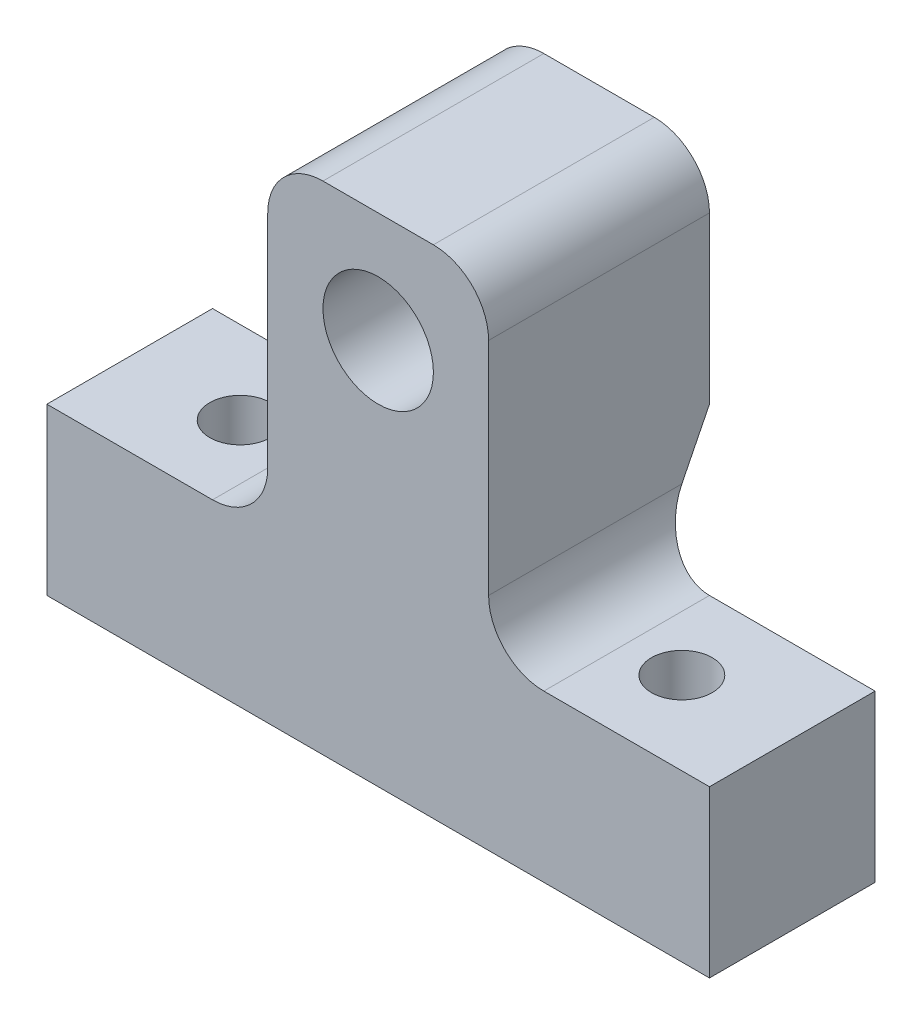
ISO-10303-21;
HEADER;
FILE_DESCRIPTION(('STEP AP214'),'2;1');
FILE_NAME('part.step','',(''),(''),'','','');
FILE_SCHEMA(('AUTOMOTIVE_DESIGN { 1 0 10303 214 1 1 1 1 }'));
ENDSEC;
DATA;
#1=APPLICATION_CONTEXT('core data for automotive mechanical design processes');
#2=APPLICATION_PROTOCOL_DEFINITION('international standard','automotive_design',2000,#1);
#3=PRODUCT_CONTEXT('',#1,'mechanical');
#4=PRODUCT('Part','Part','',(#3));
#5=PRODUCT_RELATED_PRODUCT_CATEGORY('part','',(#4));
#6=PRODUCT_DEFINITION_FORMATION('','',#4);
#7=PRODUCT_DEFINITION_CONTEXT('part definition',#1,'design');
#8=PRODUCT_DEFINITION('design','',#6,#7);
#9=PRODUCT_DEFINITION_SHAPE('','',#8);
#10=(LENGTH_UNIT() NAMED_UNIT(*) SI_UNIT(.MILLI.,.METRE.));
#11=(NAMED_UNIT(*) PLANE_ANGLE_UNIT() SI_UNIT($,.RADIAN.));
#12=(NAMED_UNIT(*) SI_UNIT($,.STERADIAN.) SOLID_ANGLE_UNIT());
#13=UNCERTAINTY_MEASURE_WITH_UNIT(LENGTH_MEASURE(1.E-05),#10,'distance_accuracy_value','');
#14=(GEOMETRIC_REPRESENTATION_CONTEXT(3) GLOBAL_UNCERTAINTY_ASSIGNED_CONTEXT((#13)) GLOBAL_UNIT_ASSIGNED_CONTEXT((#10,
#11,#12)) REPRESENTATION_CONTEXT('',''));
#15=CARTESIAN_POINT('',(0.,0.,0.));
#16=DIRECTION('',(0.,0.,1.));
#17=DIRECTION('',(1.,0.,0.));
#18=AXIS2_PLACEMENT_3D('',#15,#16,#17);
#19=CARTESIAN_POINT('',(0.,27.5,7.5));
#20=DIRECTION('',(0.,0.,-1.));
#21=DIRECTION('',(-1.,0.,0.));
#22=AXIS2_PLACEMENT_3D('',#19,#20,#21);
#23=CYLINDRICAL_SURFACE('',#22,5.);
#24=CARTESIAN_POINT('',(0.,27.5,7.5));
#25=DIRECTION('',(0.,0.,1.));
#26=DIRECTION('',(1.,0.,0.));
#27=AXIS2_PLACEMENT_3D('',#24,#25,#26);
#28=CIRCLE('',#27,5.);
#29=CARTESIAN_POINT('',(5.,27.5,7.5));
#30=VERTEX_POINT('',#29);
#31=EDGE_CURVE('E171',#30,#30,#28,.T.);
#32=ORIENTED_EDGE('',*,*,#31,.T.);
#33=EDGE_LOOP('',(#32));
#34=FACE_BOUND('',#33,.T.);
#35=CARTESIAN_POINT('',(0.,27.5,-11.5));
#36=DIRECTION('',(0.,0.,-1.));
#37=DIRECTION('',(-1.,0.,0.));
#38=AXIS2_PLACEMENT_3D('',#35,#36,#37);
#39=CIRCLE('',#38,5.);
#40=CARTESIAN_POINT('',(-5.,27.5,-11.5));
#41=VERTEX_POINT('',#40);
#42=EDGE_CURVE('E157',#41,#41,#39,.T.);
#43=ORIENTED_EDGE('',*,*,#42,.T.);
#44=EDGE_LOOP('',(#43));
#45=FACE_BOUND('',#44,.T.);
#46=ADVANCED_FACE('F41',(#34,#45),#23,.F.);
#47=CARTESIAN_POINT('',(0.,0.,7.5));
#48=DIRECTION('',(0.,0.,-1.));
#49=DIRECTION('',(-1.,0.,0.));
#50=AXIS2_PLACEMENT_3D('',#47,#48,#49);
#51=PLANE('',#50);
#52=DIRECTION('',(0.,1.,0.));
#53=VECTOR('',#52,1.);
#54=CARTESIAN_POINT('',(10.,37.5,7.5));
#55=LINE('',#54,#53);
#56=CARTESIAN_POINT('',(10.,12.5,7.5));
#57=VERTEX_POINT('',#56);
#58=CARTESIAN_POINT('',(10.,32.5,7.5));
#59=VERTEX_POINT('',#58);
#60=EDGE_CURVE('E188',#57,#59,#55,.T.);
#61=ORIENTED_EDGE('',*,*,#60,.T.);
#62=CARTESIAN_POINT('',(5.,32.5,7.5));
#63=DIRECTION('',(0.,0.,-1.));
#64=DIRECTION('',(-1.,0.,0.));
#65=AXIS2_PLACEMENT_3D('',#62,#63,#64);
#66=CIRCLE('',#65,5.);
#67=CARTESIAN_POINT('',(5.,37.5,7.5));
#68=VERTEX_POINT('',#67);
#69=EDGE_CURVE('E239',#59,#68,#66,.F.);
#70=ORIENTED_EDGE('',*,*,#69,.T.);
#71=DIRECTION('',(-1.,0.,0.));
#72=VECTOR('',#71,1.);
#73=CARTESIAN_POINT('',(-9.99999999999999,37.5,7.5));
#74=LINE('',#73,#72);
#75=CARTESIAN_POINT('',(-4.99999999999999,37.5,7.5));
#76=VERTEX_POINT('',#75);
#77=EDGE_CURVE('E194',#68,#76,#74,.T.);
#78=ORIENTED_EDGE('',*,*,#77,.T.);
#79=CARTESIAN_POINT('',(-4.99999999999999,32.5,7.5));
#80=DIRECTION('',(0.,0.,-1.));
#81=DIRECTION('',(-1.,0.,0.));
#82=AXIS2_PLACEMENT_3D('',#79,#80,#81);
#83=CIRCLE('',#82,5.);
#84=CARTESIAN_POINT('',(-9.99999999999999,32.5,7.5));
#85=VERTEX_POINT('',#84);
#86=EDGE_CURVE('E238',#76,#85,#83,.F.);
#87=ORIENTED_EDGE('',*,*,#86,.T.);
#88=DIRECTION('',(0.,-1.,0.));
#89=VECTOR('',#88,1.);
#90=CARTESIAN_POINT('',(-9.99999999999999,37.5,7.5));
#91=LINE('',#90,#89);
#92=CARTESIAN_POINT('',(-9.99999999999999,12.5,7.5));
#93=VERTEX_POINT('',#92);
#94=EDGE_CURVE('E196',#85,#93,#91,.T.);
#95=ORIENTED_EDGE('',*,*,#94,.T.);
#96=CARTESIAN_POINT('',(-15.,12.5,7.5));
#97=DIRECTION('',(0.,0.,-1.));
#98=DIRECTION('',(-1.,0.,0.));
#99=AXIS2_PLACEMENT_3D('',#96,#97,#98);
#100=CIRCLE('',#99,5.);
#101=CARTESIAN_POINT('',(-15.,7.5,7.5));
#102=VERTEX_POINT('',#101);
#103=EDGE_CURVE('E251',#93,#102,#100,.T.);
#104=ORIENTED_EDGE('',*,*,#103,.T.);
#105=DIRECTION('',(-1.,0.,0.));
#106=VECTOR('',#105,1.);
#107=CARTESIAN_POINT('',(-30.,7.5,7.5));
#108=LINE('',#107,#106);
#109=CARTESIAN_POINT('',(-30.,7.5,7.5));
#110=VERTEX_POINT('',#109);
#111=EDGE_CURVE('E197',#102,#110,#108,.T.);
#112=ORIENTED_EDGE('',*,*,#111,.T.);
#113=DIRECTION('',(0.,-1.,0.));
#114=VECTOR('',#113,1.);
#115=CARTESIAN_POINT('',(-30.,-7.5,7.5));
#116=LINE('',#115,#114);
#117=CARTESIAN_POINT('',(-30.,-7.5,7.5));
#118=VERTEX_POINT('',#117);
#119=EDGE_CURVE('E202',#110,#118,#116,.T.);
#120=ORIENTED_EDGE('',*,*,#119,.T.);
#121=DIRECTION('',(1.,0.,0.));
#122=VECTOR('',#121,1.);
#123=CARTESIAN_POINT('',(-30.,-7.5,7.5));
#124=LINE('',#123,#122);
#125=CARTESIAN_POINT('',(30.,-7.5,7.5));
#126=VERTEX_POINT('',#125);
#127=EDGE_CURVE('E204',#118,#126,#124,.T.);
#128=ORIENTED_EDGE('',*,*,#127,.T.);
#129=DIRECTION('',(0.,1.,0.));
#130=VECTOR('',#129,1.);
#131=CARTESIAN_POINT('',(30.,-7.5,7.5));
#132=LINE('',#131,#130);
#133=CARTESIAN_POINT('',(30.,7.5,7.5));
#134=VERTEX_POINT('',#133);
#135=EDGE_CURVE('E182',#126,#134,#132,.T.);
#136=ORIENTED_EDGE('',*,*,#135,.T.);
#137=DIRECTION('',(-1.,0.,0.));
#138=VECTOR('',#137,1.);
#139=CARTESIAN_POINT('',(10.,7.5,7.5));
#140=LINE('',#139,#138);
#141=CARTESIAN_POINT('',(15.,7.5,7.5));
#142=VERTEX_POINT('',#141);
#143=EDGE_CURVE('E187',#134,#142,#140,.T.);
#144=ORIENTED_EDGE('',*,*,#143,.T.);
#145=CARTESIAN_POINT('',(15.,12.5,7.5));
#146=DIRECTION('',(0.,0.,-1.));
#147=DIRECTION('',(-1.,0.,0.));
#148=AXIS2_PLACEMENT_3D('',#145,#146,#147);
#149=CIRCLE('',#148,5.);
#150=EDGE_CURVE('E11',#142,#57,#149,.T.);
#151=ORIENTED_EDGE('',*,*,#150,.T.);
#152=EDGE_LOOP('',(#61,#70,#78,#87,#95,#104,#112,#120,#128,#136,#144,#151));
#153=FACE_BOUND('',#152,.T.);
#154=ORIENTED_EDGE('',*,*,#31,.F.);
#155=EDGE_LOOP('',(#154));
#156=FACE_BOUND('',#155,.T.);
#157=ADVANCED_FACE('F261',(#153,#156),#51,.F.);
#158=CARTESIAN_POINT('',(0.,0.,-7.5));
#159=DIRECTION('',(0.,0.,-1.));
#160=DIRECTION('',(-1.,0.,0.));
#161=AXIS2_PLACEMENT_3D('',#158,#159,#160);
#162=PLANE('',#161);
#163=DIRECTION('',(-1.,0.,0.));
#164=VECTOR('',#163,1.);
#165=CARTESIAN_POINT('',(-30.,7.5,-7.5));
#166=LINE('',#165,#164);
#167=CARTESIAN_POINT('',(-15.,7.50000000000008,-7.5));
#168=VERTEX_POINT('',#167);
#169=CARTESIAN_POINT('',(-30.,7.5,-7.5));
#170=VERTEX_POINT('',#169);
#171=EDGE_CURVE('E208',#168,#170,#166,.T.);
#172=ORIENTED_EDGE('',*,*,#171,.F.);
#173=DIRECTION('',(1.,0.,0.));
#174=VECTOR('',#173,1.);
#175=CARTESIAN_POINT('',(0.,7.50000000000008,-7.5));
#176=LINE('',#175,#174);
#177=CARTESIAN_POINT('',(15.,7.5,-7.5));
#178=VERTEX_POINT('',#177);
#179=EDGE_CURVE('E57',#168,#178,#176,.T.);
#180=ORIENTED_EDGE('',*,*,#179,.T.);
#181=DIRECTION('',(-1.,0.,0.));
#182=VECTOR('',#181,1.);
#183=CARTESIAN_POINT('',(10.,7.5,-7.5));
#184=LINE('',#183,#182);
#185=CARTESIAN_POINT('',(30.,7.5,-7.5));
#186=VERTEX_POINT('',#185);
#187=EDGE_CURVE('E206',#186,#178,#184,.T.);
#188=ORIENTED_EDGE('',*,*,#187,.F.);
#189=DIRECTION('',(0.,1.,0.));
#190=VECTOR('',#189,1.);
#191=CARTESIAN_POINT('',(30.,-7.5,-7.5));
#192=LINE('',#191,#190);
#193=CARTESIAN_POINT('',(30.,-7.5,-7.5));
#194=VERTEX_POINT('',#193);
#195=EDGE_CURVE('E185',#194,#186,#192,.T.);
#196=ORIENTED_EDGE('',*,*,#195,.F.);
#197=DIRECTION('',(1.,0.,0.));
#198=VECTOR('',#197,1.);
#199=CARTESIAN_POINT('',(-30.,-7.5,-7.5));
#200=LINE('',#199,#198);
#201=CARTESIAN_POINT('',(-30.,-7.5,-7.5));
#202=VERTEX_POINT('',#201);
#203=EDGE_CURVE('E190',#202,#194,#200,.T.);
#204=ORIENTED_EDGE('',*,*,#203,.F.);
#205=DIRECTION('',(0.,-1.,0.));
#206=VECTOR('',#205,1.);
#207=CARTESIAN_POINT('',(-30.,-7.5,-7.5));
#208=LINE('',#207,#206);
#209=EDGE_CURVE('E215',#170,#202,#208,.T.);
#210=ORIENTED_EDGE('',*,*,#209,.F.);
#211=EDGE_LOOP('',(#172,#180,#188,#196,#204,#210));
#212=FACE_BOUND('',#211,.T.);
#213=ADVANCED_FACE('F272',(#212),#162,.T.);
#214=CARTESIAN_POINT('',(30.,-7.5,7.5));
#215=DIRECTION('',(-1.,0.,0.));
#216=DIRECTION('',(0.,0.,1.));
#217=AXIS2_PLACEMENT_3D('',#214,#215,#216);
#218=PLANE('',#217);
#219=ORIENTED_EDGE('',*,*,#195,.T.);
#220=DIRECTION('',(0.,0.,-1.));
#221=VECTOR('',#220,1.);
#222=CARTESIAN_POINT('',(30.,7.5,7.5));
#223=LINE('',#222,#221);
#224=EDGE_CURVE('E224',#134,#186,#223,.T.);
#225=ORIENTED_EDGE('',*,*,#224,.F.);
#226=ORIENTED_EDGE('',*,*,#135,.F.);
#227=DIRECTION('',(0.,0.,-1.));
#228=VECTOR('',#227,1.);
#229=CARTESIAN_POINT('',(30.,-7.5,7.5));
#230=LINE('',#229,#228);
#231=EDGE_CURVE('E203',#126,#194,#230,.T.);
#232=ORIENTED_EDGE('',*,*,#231,.T.);
#233=EDGE_LOOP('',(#219,#225,#226,#232));
#234=FACE_BOUND('',#233,.T.);
#235=ADVANCED_FACE('F269',(#234),#218,.F.);
#236=CARTESIAN_POINT('',(10.,7.5,7.5));
#237=DIRECTION('',(0.,-1.,0.));
#238=DIRECTION('',(0.,0.,-1.));
#239=AXIS2_PLACEMENT_3D('',#236,#237,#238);
#240=PLANE('',#239);
#241=CARTESIAN_POINT('',(20.,7.5,0.));
#242=DIRECTION('',(0.,1.,0.));
#243=DIRECTION('',(0.,0.,1.));
#244=AXIS2_PLACEMENT_3D('',#241,#242,#243);
#245=CIRCLE('',#244,2.75);
#246=CARTESIAN_POINT('',(20.,7.5,2.74999999999999));
#247=VERTEX_POINT('',#246);
#248=EDGE_CURVE('E175',#247,#247,#245,.T.);
#249=ORIENTED_EDGE('',*,*,#248,.F.);
#250=EDGE_LOOP('',(#249));
#251=FACE_BOUND('',#250,.T.);
#252=ORIENTED_EDGE('',*,*,#187,.T.);
#253=DIRECTION('',(0.,0.,-1.));
#254=VECTOR('',#253,1.);
#255=CARTESIAN_POINT('',(15.,7.5,7.5));
#256=LINE('',#255,#254);
#257=EDGE_CURVE('E249',#178,#142,#256,.F.);
#258=ORIENTED_EDGE('',*,*,#257,.T.);
#259=ORIENTED_EDGE('',*,*,#143,.F.);
#260=ORIENTED_EDGE('',*,*,#224,.T.);
#261=EDGE_LOOP('',(#252,#258,#259,#260));
#262=FACE_BOUND('',#261,.T.);
#263=ADVANCED_FACE('F256',(#251,#262),#240,.F.);
#264=CARTESIAN_POINT('',(10.,37.5,7.5));
#265=DIRECTION('',(-1.,0.,0.));
#266=DIRECTION('',(0.,-1.,0.));
#267=AXIS2_PLACEMENT_3D('',#264,#265,#266);
#268=PLANE('',#267);
#269=DIRECTION('',(0.,-1.,0.));
#270=VECTOR('',#269,1.);
#271=CARTESIAN_POINT('',(10.,37.5,-12.5));
#272=LINE('',#271,#270);
#273=CARTESIAN_POINT('',(10.,32.5,-12.5));
#274=VERTEX_POINT('',#273);
#275=CARTESIAN_POINT('',(10.,17.5,-12.5));
#276=VERTEX_POINT('',#275);
#277=EDGE_CURVE('E139',#274,#276,#272,.T.);
#278=ORIENTED_EDGE('',*,*,#277,.F.);
#279=DIRECTION('',(0.,0.,-1.));
#280=VECTOR('',#279,1.);
#281=CARTESIAN_POINT('',(10.,32.5,7.5));
#282=LINE('',#281,#280);
#283=EDGE_CURVE('E236',#274,#59,#282,.F.);
#284=ORIENTED_EDGE('',*,*,#283,.T.);
#285=ORIENTED_EDGE('',*,*,#60,.F.);
#286=DIRECTION('',(0.,0.,-1.));
#287=VECTOR('',#286,1.);
#288=CARTESIAN_POINT('',(10.,12.5,-7.5));
#289=LINE('',#288,#287);
#290=CARTESIAN_POINT('',(10.,12.5,-9.99999999999997));
#291=VERTEX_POINT('',#290);
#292=EDGE_CURVE('E145',#57,#291,#289,.T.);
#293=ORIENTED_EDGE('',*,*,#292,.T.);
#294=DIRECTION('',(0.,0.894427190999915,-0.447213595499959));
#295=VECTOR('',#294,1.);
#296=CARTESIAN_POINT('',(10.,25.5,-16.5));
#297=LINE('',#296,#295);
#298=EDGE_CURVE('E134',#291,#276,#297,.T.);
#299=ORIENTED_EDGE('',*,*,#298,.T.);
#300=EDGE_LOOP('',(#278,#284,#285,#293,#299));
#301=FACE_BOUND('',#300,.T.);
#302=ADVANCED_FACE('F140',(#301),#268,.F.);
#303=CARTESIAN_POINT('',(-9.99999999999999,37.5,7.5));
#304=DIRECTION('',(0.,-1.,0.));
#305=DIRECTION('',(0.,0.,-1.));
#306=AXIS2_PLACEMENT_3D('',#303,#304,#305);
#307=PLANE('',#306);
#308=ORIENTED_EDGE('',*,*,#77,.F.);
#309=DIRECTION('',(0.,0.,-1.));
#310=VECTOR('',#309,1.);
#311=CARTESIAN_POINT('',(5.,37.5,7.5));
#312=LINE('',#311,#310);
#313=CARTESIAN_POINT('',(5.,37.5,-12.5));
#314=VERTEX_POINT('',#313);
#315=EDGE_CURVE('E230',#68,#314,#312,.T.);
#316=ORIENTED_EDGE('',*,*,#315,.T.);
#317=DIRECTION('',(1.,0.,0.));
#318=VECTOR('',#317,1.);
#319=CARTESIAN_POINT('',(10.,37.5,-12.5));
#320=LINE('',#319,#318);
#321=CARTESIAN_POINT('',(-4.99999999999999,37.5,-12.5));
#322=VERTEX_POINT('',#321);
#323=EDGE_CURVE('E162',#322,#314,#320,.T.);
#324=ORIENTED_EDGE('',*,*,#323,.F.);
#325=DIRECTION('',(0.,0.,-1.));
#326=VECTOR('',#325,1.);
#327=CARTESIAN_POINT('',(-4.99999999999999,37.5,7.5));
#328=LINE('',#327,#326);
#329=EDGE_CURVE('E144',#322,#76,#328,.F.);
#330=ORIENTED_EDGE('',*,*,#329,.T.);
#331=EDGE_LOOP('',(#308,#316,#324,#330));
#332=FACE_BOUND('',#331,.T.);
#333=ADVANCED_FACE('F300',(#332),#307,.F.);
#334=CARTESIAN_POINT('',(-9.99999999999999,37.5,7.5));
#335=DIRECTION('',(1.,0.,0.));
#336=DIRECTION('',(0.,1.,0.));
#337=AXIS2_PLACEMENT_3D('',#334,#335,#336);
#338=PLANE('',#337);
#339=ORIENTED_EDGE('',*,*,#94,.F.);
#340=DIRECTION('',(0.,0.,-1.));
#341=VECTOR('',#340,1.);
#342=CARTESIAN_POINT('',(-9.99999999999999,32.5,7.5));
#343=LINE('',#342,#341);
#344=CARTESIAN_POINT('',(-9.99999999999999,32.5,-12.5));
#345=VERTEX_POINT('',#344);
#346=EDGE_CURVE('E242',#85,#345,#343,.T.);
#347=ORIENTED_EDGE('',*,*,#346,.T.);
#348=DIRECTION('',(0.,1.,0.));
#349=VECTOR('',#348,1.);
#350=CARTESIAN_POINT('',(-9.99999999999999,17.5,-12.5));
#351=LINE('',#350,#349);
#352=CARTESIAN_POINT('',(-9.99999999999999,17.5,-12.5));
#353=VERTEX_POINT('',#352);
#354=EDGE_CURVE('E158',#353,#345,#351,.T.);
#355=ORIENTED_EDGE('',*,*,#354,.F.);
#356=DIRECTION('',(0.,-0.894427190999915,0.447213595499959));
#357=VECTOR('',#356,1.);
#358=CARTESIAN_POINT('',(-9.99999999999999,25.5,-16.5));
#359=LINE('',#358,#357);
#360=CARTESIAN_POINT('',(-9.99999999999999,12.5,-9.99999999999997));
#361=VERTEX_POINT('',#360);
#362=EDGE_CURVE('E143',#353,#361,#359,.T.);
#363=ORIENTED_EDGE('',*,*,#362,.T.);
#364=DIRECTION('',(0.,0.,-1.));
#365=VECTOR('',#364,1.);
#366=CARTESIAN_POINT('',(-9.99999999999999,12.5,7.5));
#367=LINE('',#366,#365);
#368=EDGE_CURVE('E245',#361,#93,#367,.F.);
#369=ORIENTED_EDGE('',*,*,#368,.T.);
#370=EDGE_LOOP('',(#339,#347,#355,#363,#369));
#371=FACE_BOUND('',#370,.T.);
#372=ADVANCED_FACE('F288',(#371),#338,.F.);
#373=CARTESIAN_POINT('',(-30.,7.5,7.5));
#374=DIRECTION('',(0.,-1.,0.));
#375=DIRECTION('',(0.,0.,-1.));
#376=AXIS2_PLACEMENT_3D('',#373,#374,#375);
#377=PLANE('',#376);
#378=CARTESIAN_POINT('',(-20.,7.5,0.));
#379=DIRECTION('',(0.,1.,0.));
#380=DIRECTION('',(0.,0.,1.));
#381=AXIS2_PLACEMENT_3D('',#378,#379,#380);
#382=CIRCLE('',#381,2.75);
#383=CARTESIAN_POINT('',(-20.,7.5,2.75));
#384=VERTEX_POINT('',#383);
#385=EDGE_CURVE('E174',#384,#384,#382,.T.);
#386=ORIENTED_EDGE('',*,*,#385,.F.);
#387=EDGE_LOOP('',(#386));
#388=FACE_BOUND('',#387,.T.);
#389=ORIENTED_EDGE('',*,*,#111,.F.);
#390=DIRECTION('',(0.,0.,-1.));
#391=VECTOR('',#390,1.);
#392=CARTESIAN_POINT('',(-15.,7.5,-7.5));
#393=LINE('',#392,#391);
#394=EDGE_CURVE('E250',#102,#168,#393,.T.);
#395=ORIENTED_EDGE('',*,*,#394,.T.);
#396=ORIENTED_EDGE('',*,*,#171,.T.);
#397=DIRECTION('',(0.,0.,-1.));
#398=VECTOR('',#397,1.);
#399=CARTESIAN_POINT('',(-30.,7.5,7.5));
#400=LINE('',#399,#398);
#401=EDGE_CURVE('E219',#110,#170,#400,.T.);
#402=ORIENTED_EDGE('',*,*,#401,.F.);
#403=EDGE_LOOP('',(#389,#395,#396,#402));
#404=FACE_BOUND('',#403,.T.);
#405=ADVANCED_FACE('F285',(#388,#404),#377,.F.);
#406=CARTESIAN_POINT('',(-30.,-7.5,7.5));
#407=DIRECTION('',(1.,0.,0.));
#408=DIRECTION('',(0.,0.,-1.));
#409=AXIS2_PLACEMENT_3D('',#406,#407,#408);
#410=PLANE('',#409);
#411=ORIENTED_EDGE('',*,*,#209,.T.);
#412=DIRECTION('',(0.,0.,-1.));
#413=VECTOR('',#412,1.);
#414=CARTESIAN_POINT('',(-30.,-7.5,7.5));
#415=LINE('',#414,#413);
#416=EDGE_CURVE('E220',#118,#202,#415,.T.);
#417=ORIENTED_EDGE('',*,*,#416,.F.);
#418=ORIENTED_EDGE('',*,*,#119,.F.);
#419=ORIENTED_EDGE('',*,*,#401,.T.);
#420=EDGE_LOOP('',(#411,#417,#418,#419));
#421=FACE_BOUND('',#420,.T.);
#422=ADVANCED_FACE('F279',(#421),#410,.F.);
#423=CARTESIAN_POINT('',(-30.,-7.5,7.5));
#424=DIRECTION('',(0.,1.,0.));
#425=DIRECTION('',(0.,0.,1.));
#426=AXIS2_PLACEMENT_3D('',#423,#424,#425);
#427=PLANE('',#426);
#428=CARTESIAN_POINT('',(20.,-7.5,0.));
#429=DIRECTION('',(0.,1.,0.));
#430=DIRECTION('',(0.,0.,1.));
#431=AXIS2_PLACEMENT_3D('',#428,#429,#430);
#432=CIRCLE('',#431,2.75);
#433=CARTESIAN_POINT('',(20.,-7.5,2.74999999999999));
#434=VERTEX_POINT('',#433);
#435=EDGE_CURVE('E166',#434,#434,#432,.T.);
#436=ORIENTED_EDGE('',*,*,#435,.T.);
#437=EDGE_LOOP('',(#436));
#438=FACE_BOUND('',#437,.T.);
#439=CARTESIAN_POINT('',(-20.,-7.5,0.));
#440=DIRECTION('',(0.,1.,0.));
#441=DIRECTION('',(0.,0.,1.));
#442=AXIS2_PLACEMENT_3D('',#439,#440,#441);
#443=CIRCLE('',#442,2.75);
#444=CARTESIAN_POINT('',(-20.,-7.5,2.75));
#445=VERTEX_POINT('',#444);
#446=EDGE_CURVE('E170',#445,#445,#443,.T.);
#447=ORIENTED_EDGE('',*,*,#446,.T.);
#448=EDGE_LOOP('',(#447));
#449=FACE_BOUND('',#448,.T.);
#450=ORIENTED_EDGE('',*,*,#203,.T.);
#451=ORIENTED_EDGE('',*,*,#231,.F.);
#452=ORIENTED_EDGE('',*,*,#127,.F.);
#453=ORIENTED_EDGE('',*,*,#416,.T.);
#454=EDGE_LOOP('',(#450,#451,#452,#453));
#455=FACE_BOUND('',#454,.T.);
#456=ADVANCED_FACE('F274',(#438,#449,#455),#427,.F.);
#457=CARTESIAN_POINT('',(-20.,-7.5,0.));
#458=DIRECTION('',(0.,1.,0.));
#459=DIRECTION('',(0.,0.,1.));
#460=AXIS2_PLACEMENT_3D('',#457,#458,#459);
#461=CYLINDRICAL_SURFACE('',#460,2.75);
#462=ORIENTED_EDGE('',*,*,#446,.F.);
#463=EDGE_LOOP('',(#462));
#464=FACE_BOUND('',#463,.T.);
#465=ORIENTED_EDGE('',*,*,#385,.T.);
#466=EDGE_LOOP('',(#465));
#467=FACE_BOUND('',#466,.T.);
#468=ADVANCED_FACE('F321',(#464,#467),#461,.F.);
#469=CARTESIAN_POINT('',(20.,-7.5,0.));
#470=DIRECTION('',(0.,1.,0.));
#471=DIRECTION('',(0.,0.,1.));
#472=AXIS2_PLACEMENT_3D('',#469,#470,#471);
#473=CYLINDRICAL_SURFACE('',#472,2.75);
#474=ORIENTED_EDGE('',*,*,#435,.F.);
#475=EDGE_LOOP('',(#474));
#476=FACE_BOUND('',#475,.T.);
#477=ORIENTED_EDGE('',*,*,#248,.T.);
#478=EDGE_LOOP('',(#477));
#479=FACE_BOUND('',#478,.T.);
#480=ADVANCED_FACE('F371',(#476,#479),#473,.F.);
#481=CARTESIAN_POINT('',(0.,0.,-12.5));
#482=DIRECTION('',(0.,0.,-1.));
#483=DIRECTION('',(-1.,0.,0.));
#484=AXIS2_PLACEMENT_3D('',#481,#482,#483);
#485=PLANE('',#484);
#486=ORIENTED_EDGE('',*,*,#323,.T.);
#487=CARTESIAN_POINT('',(5.,32.5,-12.5));
#488=DIRECTION('',(0.,0.,-1.));
#489=DIRECTION('',(-1.,0.,0.));
#490=AXIS2_PLACEMENT_3D('',#487,#488,#489);
#491=CIRCLE('',#490,5.);
#492=EDGE_CURVE('E154',#314,#274,#491,.T.);
#493=ORIENTED_EDGE('',*,*,#492,.T.);
#494=ORIENTED_EDGE('',*,*,#277,.T.);
#495=DIRECTION('',(-1.,0.,0.));
#496=VECTOR('',#495,1.);
#497=CARTESIAN_POINT('',(10.,17.5,-12.5));
#498=LINE('',#497,#496);
#499=EDGE_CURVE('E153',#276,#353,#498,.T.);
#500=ORIENTED_EDGE('',*,*,#499,.T.);
#501=ORIENTED_EDGE('',*,*,#354,.T.);
#502=CARTESIAN_POINT('',(-4.99999999999999,32.5,-12.5));
#503=DIRECTION('',(0.,0.,-1.));
#504=DIRECTION('',(-1.,0.,0.));
#505=AXIS2_PLACEMENT_3D('',#502,#503,#504);
#506=CIRCLE('',#505,5.);
#507=EDGE_CURVE('E235',#345,#322,#506,.T.);
#508=ORIENTED_EDGE('',*,*,#507,.T.);
#509=EDGE_LOOP('',(#486,#493,#494,#500,#501,#508));
#510=FACE_BOUND('',#509,.T.);
#511=CARTESIAN_POINT('',(0.,27.5,-12.5));
#512=DIRECTION('',(0.,0.,-1.));
#513=DIRECTION('',(-1.,0.,0.));
#514=AXIS2_PLACEMENT_3D('',#511,#512,#513);
#515=CIRCLE('',#514,2.75);
#516=CARTESIAN_POINT('',(-2.75,27.5,-12.5));
#517=VERTEX_POINT('',#516);
#518=EDGE_CURVE('E510',#517,#517,#515,.T.);
#519=ORIENTED_EDGE('',*,*,#518,.F.);
#520=EDGE_LOOP('',(#519));
#521=FACE_BOUND('',#520,.T.);
#522=ADVANCED_FACE('F148',(#510,#521),#485,.T.);
#523=CARTESIAN_POINT('',(0.,27.5,-11.5));
#524=DIRECTION('',(0.,0.,-1.));
#525=DIRECTION('',(-1.,0.,0.));
#526=AXIS2_PLACEMENT_3D('',#523,#524,#525);
#527=PLANE('',#526);
#528=CARTESIAN_POINT('',(0.,27.5,-11.5));
#529=DIRECTION('',(0.,0.,-1.));
#530=DIRECTION('',(-1.,0.,0.));
#531=AXIS2_PLACEMENT_3D('',#528,#529,#530);
#532=CIRCLE('',#531,2.75);
#533=CARTESIAN_POINT('',(-2.75,27.5,-11.5));
#534=VERTEX_POINT('',#533);
#535=EDGE_CURVE('E502',#534,#534,#532,.T.);
#536=ORIENTED_EDGE('',*,*,#535,.T.);
#537=EDGE_LOOP('',(#536));
#538=FACE_BOUND('',#537,.T.);
#539=ORIENTED_EDGE('',*,*,#42,.F.);
#540=EDGE_LOOP('',(#539));
#541=FACE_BOUND('',#540,.T.);
#542=ADVANCED_FACE('F412',(#538,#541),#527,.F.);
#543=CARTESIAN_POINT('',(0.,27.5,-11.5));
#544=DIRECTION('',(0.,0.,-1.));
#545=DIRECTION('',(-1.,0.,0.));
#546=AXIS2_PLACEMENT_3D('',#543,#544,#545);
#547=CYLINDRICAL_SURFACE('',#546,2.75);
#548=ORIENTED_EDGE('',*,*,#535,.F.);
#549=EDGE_LOOP('',(#548));
#550=FACE_BOUND('',#549,.T.);
#551=ORIENTED_EDGE('',*,*,#518,.T.);
#552=EDGE_LOOP('',(#551));
#553=FACE_BOUND('',#552,.T.);
#554=ADVANCED_FACE('F311',(#550,#553),#547,.F.);
#555=CARTESIAN_POINT('',(10.,17.5,-12.5));
#556=DIRECTION('',(0.,0.447213595499959,0.894427190999915));
#557=DIRECTION('',(-1.,0.,0.));
#558=AXIS2_PLACEMENT_3D('',#555,#556,#557);
#559=PLANE('',#558);
#560=ORIENTED_EDGE('',*,*,#298,.F.);
#561=CARTESIAN_POINT('',(15.,12.5,-9.99999999999997));
#562=DIRECTION('',(0.,0.447213595499959,0.894427190999915));
#563=DIRECTION('',(0.,-0.894427190999915,0.447213595499959));
#564=AXIS2_PLACEMENT_3D('',#561,#562,#563);
#565=ELLIPSE('',#564,5.59016994374948,5.);
#566=EDGE_CURVE('E47',#291,#178,#565,.T.);
#567=ORIENTED_EDGE('',*,*,#566,.T.);
#568=ORIENTED_EDGE('',*,*,#179,.F.);
#569=CARTESIAN_POINT('',(-15.,12.5,-9.99999999999997));
#570=DIRECTION('',(0.,0.447213595499959,0.894427190999915));
#571=DIRECTION('',(0.,-0.894427190999915,0.447213595499959));
#572=AXIS2_PLACEMENT_3D('',#569,#570,#571);
#573=ELLIPSE('',#572,5.59016994374948,5.);
#574=EDGE_CURVE('E255',#168,#361,#573,.T.);
#575=ORIENTED_EDGE('',*,*,#574,.T.);
#576=ORIENTED_EDGE('',*,*,#362,.F.);
#577=ORIENTED_EDGE('',*,*,#499,.F.);
#578=EDGE_LOOP('',(#560,#567,#568,#575,#576,#577));
#579=FACE_BOUND('',#578,.T.);
#580=ADVANCED_FACE('F159',(#579),#559,.F.);
#581=CARTESIAN_POINT('',(5.,32.5,7.5));
#582=DIRECTION('',(0.,0.,-1.));
#583=DIRECTION('',(-1.,0.,0.));
#584=AXIS2_PLACEMENT_3D('',#581,#582,#583);
#585=CYLINDRICAL_SURFACE('',#584,5.);
#586=ORIENTED_EDGE('',*,*,#69,.F.);
#587=ORIENTED_EDGE('',*,*,#283,.F.);
#588=ORIENTED_EDGE('',*,*,#492,.F.);
#589=ORIENTED_EDGE('',*,*,#315,.F.);
#590=EDGE_LOOP('',(#586,#587,#588,#589));
#591=FACE_BOUND('',#590,.T.);
#592=ADVANCED_FACE('F303',(#591),#585,.T.);
#593=CARTESIAN_POINT('',(-4.99999999999999,32.5,7.5));
#594=DIRECTION('',(0.,0.,-1.));
#595=DIRECTION('',(-1.,0.,0.));
#596=AXIS2_PLACEMENT_3D('',#593,#594,#595);
#597=CYLINDRICAL_SURFACE('',#596,5.);
#598=ORIENTED_EDGE('',*,*,#86,.F.);
#599=ORIENTED_EDGE('',*,*,#329,.F.);
#600=ORIENTED_EDGE('',*,*,#507,.F.);
#601=ORIENTED_EDGE('',*,*,#346,.F.);
#602=EDGE_LOOP('',(#598,#599,#600,#601));
#603=FACE_BOUND('',#602,.T.);
#604=ADVANCED_FACE('F297',(#603),#597,.T.);
#605=CARTESIAN_POINT('',(-15.,12.5,7.5));
#606=DIRECTION('',(0.,0.,1.));
#607=DIRECTION('',(1.,0.,0.));
#608=AXIS2_PLACEMENT_3D('',#605,#606,#607);
#609=CYLINDRICAL_SURFACE('',#608,5.);
#610=ORIENTED_EDGE('',*,*,#103,.F.);
#611=ORIENTED_EDGE('',*,*,#368,.F.);
#612=ORIENTED_EDGE('',*,*,#574,.F.);
#613=ORIENTED_EDGE('',*,*,#394,.F.);
#614=EDGE_LOOP('',(#610,#611,#612,#613));
#615=FACE_BOUND('',#614,.T.);
#616=ADVANCED_FACE('F287',(#615),#609,.F.);
#617=CARTESIAN_POINT('',(15.,12.5,7.5));
#618=DIRECTION('',(0.,0.,1.));
#619=DIRECTION('',(1.,0.,0.));
#620=AXIS2_PLACEMENT_3D('',#617,#618,#619);
#621=CYLINDRICAL_SURFACE('',#620,5.);
#622=ORIENTED_EDGE('',*,*,#150,.F.);
#623=ORIENTED_EDGE('',*,*,#257,.F.);
#624=ORIENTED_EDGE('',*,*,#566,.F.);
#625=ORIENTED_EDGE('',*,*,#292,.F.);
#626=EDGE_LOOP('',(#622,#623,#624,#625));
#627=FACE_BOUND('',#626,.T.);
#628=ADVANCED_FACE('F43',(#627),#621,.F.);
#629=CLOSED_SHELL('',(#46,#157,#213,#235,#263,#302,#333,#372,#405,#422,#456,#468,#480,#522,#542,
#554,#580,#592,#604,#616,#628));
#630=MANIFOLD_SOLID_BREP('B2',#629);
#631=ADVANCED_BREP_SHAPE_REPRESENTATION('',(#18,#630),#14);
#632=SHAPE_DEFINITION_REPRESENTATION(#9,#631);
ENDSEC;
END-ISO-10303-21;
